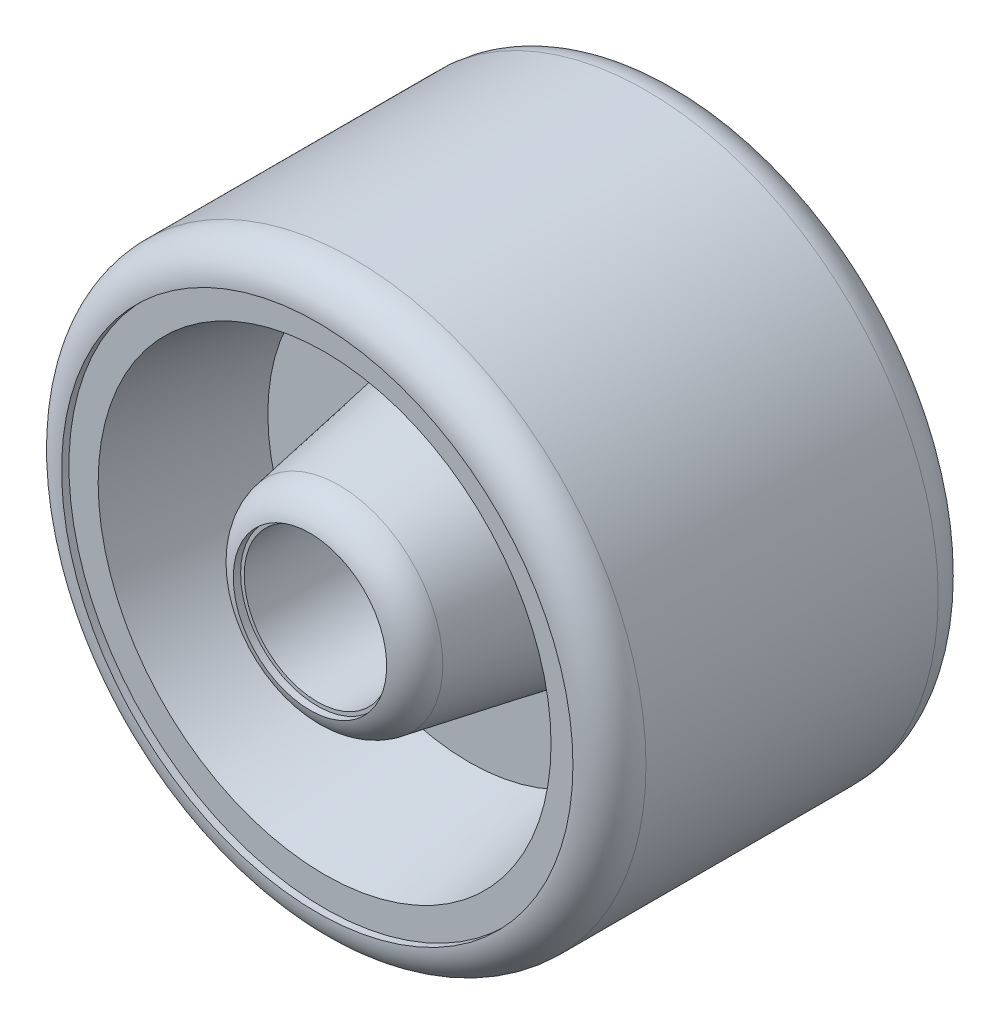
ISO-10303-21;
HEADER;
FILE_DESCRIPTION(('STEP AP214'),'2;1');
FILE_NAME('part.step','',(''),(''),'','','');
FILE_SCHEMA(('AUTOMOTIVE_DESIGN { 1 0 10303 214 1 1 1 1 }'));
ENDSEC;
DATA;
#1=APPLICATION_CONTEXT('core data for automotive mechanical design processes');
#2=APPLICATION_PROTOCOL_DEFINITION('international standard','automotive_design',2000,#1);
#3=PRODUCT_CONTEXT('',#1,'mechanical');
#4=PRODUCT('Part','Part','',(#3));
#5=PRODUCT_RELATED_PRODUCT_CATEGORY('part','',(#4));
#6=PRODUCT_DEFINITION_FORMATION('','',#4);
#7=PRODUCT_DEFINITION_CONTEXT('part definition',#1,'design');
#8=PRODUCT_DEFINITION('design','',#6,#7);
#9=PRODUCT_DEFINITION_SHAPE('','',#8);
#10=(LENGTH_UNIT() NAMED_UNIT(*) SI_UNIT(.MILLI.,.METRE.));
#11=(NAMED_UNIT(*) PLANE_ANGLE_UNIT() SI_UNIT($,.RADIAN.));
#12=(NAMED_UNIT(*) SI_UNIT($,.STERADIAN.) SOLID_ANGLE_UNIT());
#13=UNCERTAINTY_MEASURE_WITH_UNIT(LENGTH_MEASURE(1.E-05),#10,'distance_accuracy_value','');
#14=(GEOMETRIC_REPRESENTATION_CONTEXT(3) GLOBAL_UNCERTAINTY_ASSIGNED_CONTEXT((#13)) GLOBAL_UNIT_ASSIGNED_CONTEXT((#10,
#11,#12)) REPRESENTATION_CONTEXT('',''));
#15=CARTESIAN_POINT('',(0.,0.,0.));
#16=DIRECTION('',(0.,0.,1.));
#17=DIRECTION('',(1.,0.,0.));
#18=AXIS2_PLACEMENT_3D('',#15,#16,#17);
#19=CARTESIAN_POINT('',(0.,0.,-5.2));
#20=DIRECTION('',(0.,0.,1.));
#21=DIRECTION('',(1.,0.,0.));
#22=AXIS2_PLACEMENT_3D('',#19,#20,#21);
#23=CONICAL_SURFACE('',#22,2.7,0.17453292519943);
#24=CARTESIAN_POINT('',(0.,0.,-4.40398603033135));
#25=DIRECTION('',(0.,0.,1.));
#26=DIRECTION('',(1.,0.,0.));
#27=AXIS2_PLACEMENT_3D('',#24,#25,#26);
#28=CIRCLE('',#27,2.84035873987343);
#29=CARTESIAN_POINT('',(2.84035873987343,0.,-4.40398603033135));
#30=VERTEX_POINT('',#29);
#31=EDGE_CURVE('E11',#30,#30,#28,.T.);
#32=ORIENTED_EDGE('',*,*,#31,.T.);
#33=EDGE_LOOP('',(#32));
#34=FACE_BOUND('',#33,.T.);
#35=CARTESIAN_POINT('',(-0.408507555009763,0.,-4.55795216445944));
#36=DIRECTION('',(0.6357072528611,0.,0.77193023561705));
#37=DIRECTION('',(-0.77193023561705,0.,0.6357072528611));
#38=AXIS2_PLACEMENT_3D('',#35,#36,#37);
#39=ELLIPSE('',#38,3.64438420275442,2.78339254981343);
#40=CARTESIAN_POINT('',(-3.0873299939569,-0.85,-2.35186309709122));
#41=VERTEX_POINT('',#40);
#42=CARTESIAN_POINT('',(-3.0873299939569,0.85,-2.35186309709122));
#43=VERTEX_POINT('',#42);
#44=EDGE_CURVE('E55',#41,#43,#39,.F.);
#45=ORIENTED_EDGE('',*,*,#44,.T.);
#46=CARTESIAN_POINT('',(-2.6955284811266,0.85,-4.48331367974718));
#47=CARTESIAN_POINT('',(-2.76849470780288,0.85,-4.08863495322271));
#48=CARTESIAN_POINT('',(-2.84121082290954,0.85,-3.6939101053953));
#49=CARTESIAN_POINT('',(-2.98623000568182,0.85,-2.90438467063099));
#50=CARTESIAN_POINT('',(-3.05853307349392,0.85,-2.509584083721));
#51=CARTESIAN_POINT('',(-3.27495337155501,0.85,-1.32509400854848));
#52=CARTESIAN_POINT('',(-3.41858187322156,0.85,-0.535315247189798));
#53=CARTESIAN_POINT('',(-3.61183976031534,0.85,0.530791513182152));
#54=CARTESIAN_POINT('',(-3.66186159002427,0.85,0.807048459745819));
#55=CARTESIAN_POINT('',(-3.71183747467513,0.85,1.08331367974719));
#56=B_SPLINE_CURVE_WITH_KNOTS('',3,(#46,#47,#48,#49,#50,#51,#52,#53,#54,#55),.UNSPECIFIED.,.F.,
.F.,(4,2,2,2,4),(0.,1.20410036856632,2.4082003100859,4.81639726867198,5.65864466793987),.UNSPECIFIED.);
#57=CARTESIAN_POINT('',(-3.36121169921079,0.85,-0.849999999999999));
#58=VERTEX_POINT('',#57);
#59=EDGE_CURVE('E87',#43,#58,#56,.T.);
#60=ORIENTED_EDGE('',*,*,#59,.T.);
#61=CARTESIAN_POINT('',(0.,0.,-0.849999999999999));
#62=DIRECTION('',(0.,0.,-1.));
#63=DIRECTION('',(-1.,0.,0.));
#64=AXIS2_PLACEMENT_3D('',#61,#62,#63);
#65=CIRCLE('',#64,3.46702236608181);
#66=CARTESIAN_POINT('',(-3.36121169921079,-0.85,-0.849999999999999));
#67=VERTEX_POINT('',#66);
#68=EDGE_CURVE('E189',#58,#67,#65,.T.);
#69=ORIENTED_EDGE('',*,*,#68,.T.);
#70=CARTESIAN_POINT('',(-2.6955284811266,-0.85,-4.48331367974718));
#71=CARTESIAN_POINT('',(-2.76849470780288,-0.85,-4.08863495322271));
#72=CARTESIAN_POINT('',(-2.84121082290953,-0.85,-3.6939101053953));
#73=CARTESIAN_POINT('',(-2.98623000568182,-0.85,-2.90438467063099));
#74=CARTESIAN_POINT('',(-3.05853307349392,-0.85,-2.50958408372101));
#75=CARTESIAN_POINT('',(-3.27495337155501,-0.85,-1.32509400854848));
#76=CARTESIAN_POINT('',(-3.41858187322156,-0.85,-0.535315247189802));
#77=CARTESIAN_POINT('',(-3.61183976031534,-0.85,0.530791513182149));
#78=CARTESIAN_POINT('',(-3.66186159002427,-0.85,0.807048459745817));
#79=CARTESIAN_POINT('',(-3.71183747467513,-0.85,1.08331367974719));
#80=B_SPLINE_CURVE_WITH_KNOTS('',3,(#70,#71,#72,#73,#74,#75,#76,#77,#78,#79),.UNSPECIFIED.,.F.,
.F.,(4,2,2,2,4),(0.,1.20410036856632,2.4082003100859,4.81639726867198,5.65864466793988),.UNSPECIFIED.);
#81=EDGE_CURVE('E60',#41,#67,#80,.T.);
#82=ORIENTED_EDGE('',*,*,#81,.F.);
#83=EDGE_LOOP('',(#45,#60,#69,#82));
#84=FACE_BOUND('',#83,.T.);
#85=ADVANCED_FACE('F40',(#34,#84),#23,.T.);
#86=CARTESIAN_POINT('',(-3.46702236608181,0.,-0.849999999999999));
#87=DIRECTION('',(0.,0.,-1.));
#88=DIRECTION('',(-1.,0.,0.));
#89=AXIS2_PLACEMENT_3D('',#86,#87,#88);
#90=PLANE('',#89);
#91=CARTESIAN_POINT('',(0.,0.,-0.85));
#92=DIRECTION('',(0.,0.,-1.));
#93=DIRECTION('',(-1.,0.,0.));
#94=AXIS2_PLACEMENT_3D('',#91,#92,#93);
#95=CIRCLE('',#94,5.50350842620158);
#96=CARTESIAN_POINT('',(-5.50350842620158,0.,-0.849999999999999));
#97=VERTEX_POINT('',#96);
#98=EDGE_CURVE('E187',#97,#97,#95,.T.);
#99=ORIENTED_EDGE('',*,*,#98,.T.);
#100=EDGE_LOOP('',(#99));
#101=FACE_BOUND('',#100,.T.);
#102=ORIENTED_EDGE('',*,*,#68,.F.);
#103=DIRECTION('',(1.,0.,0.));
#104=VECTOR('',#103,1.);
#105=CARTESIAN_POINT('',(-2.54673518328194,0.85,-0.85));
#106=LINE('',#105,#104);
#107=CARTESIAN_POINT('',(-4.54673518328194,0.85,-0.849999999999999));
#108=VERTEX_POINT('',#107);
#109=EDGE_CURVE('E102',#108,#58,#106,.T.);
#110=ORIENTED_EDGE('',*,*,#109,.F.);
#111=DIRECTION('',(0.,-1.,0.));
#112=VECTOR('',#111,1.);
#113=CARTESIAN_POINT('',(-4.54673518328194,0.85,-0.850000000000001));
#114=LINE('',#113,#112);
#115=CARTESIAN_POINT('',(-4.54673518328194,-0.85,-0.850000000000001));
#116=VERTEX_POINT('',#115);
#117=EDGE_CURVE('E99',#108,#116,#114,.T.);
#118=ORIENTED_EDGE('',*,*,#117,.T.);
#119=DIRECTION('',(1.,0.,0.));
#120=VECTOR('',#119,1.);
#121=CARTESIAN_POINT('',(-2.54673518328194,-0.85,-0.85));
#122=LINE('',#121,#120);
#123=EDGE_CURVE('E89',#116,#67,#122,.T.);
#124=ORIENTED_EDGE('',*,*,#123,.T.);
#125=EDGE_LOOP('',(#102,#110,#118,#124));
#126=FACE_BOUND('',#125,.T.);
#127=ADVANCED_FACE('F171',(#101,#126),#90,.T.);
#128=CARTESIAN_POINT('',(0.,0.,5.));
#129=DIRECTION('',(0.,0.,-1.));
#130=DIRECTION('',(-1.,0.,0.));
#131=AXIS2_PLACEMENT_3D('',#128,#129,#130);
#132=CYLINDRICAL_SURFACE('',#131,7.);
#133=CARTESIAN_POINT('',(0.,0.,-4.8));
#134=DIRECTION('',(0.,0.,-1.));
#135=DIRECTION('',(-1.,0.,0.));
#136=AXIS2_PLACEMENT_3D('',#133,#134,#135);
#137=CIRCLE('',#136,7.);
#138=CARTESIAN_POINT('',(-7.,0.,-4.8));
#139=VERTEX_POINT('',#138);
#140=EDGE_CURVE('E217',#139,#139,#137,.T.);
#141=ORIENTED_EDGE('',*,*,#140,.F.);
#142=EDGE_LOOP('',(#141));
#143=FACE_BOUND('',#142,.T.);
#144=CARTESIAN_POINT('',(0.,0.,-5.));
#145=DIRECTION('',(0.,0.,1.));
#146=DIRECTION('',(1.,0.,0.));
#147=AXIS2_PLACEMENT_3D('',#144,#145,#146);
#148=CIRCLE('',#147,7.);
#149=CARTESIAN_POINT('',(7.,0.,-5.));
#150=VERTEX_POINT('',#149);
#151=EDGE_CURVE('E202',#150,#150,#148,.T.);
#152=ORIENTED_EDGE('',*,*,#151,.F.);
#153=EDGE_LOOP('',(#152));
#154=FACE_BOUND('',#153,.T.);
#155=ADVANCED_FACE('F173',(#143,#154),#132,.F.);
#156=CARTESIAN_POINT('',(0.,0.,5.));
#157=DIRECTION('',(0.,0.,-1.));
#158=DIRECTION('',(-1.,0.,0.));
#159=AXIS2_PLACEMENT_3D('',#156,#157,#158);
#160=CYLINDRICAL_SURFACE('',#159,8.);
#161=CARTESIAN_POINT('',(0.,0.,-4.));
#162=DIRECTION('',(0.,0.,1.));
#163=DIRECTION('',(1.,0.,0.));
#164=AXIS2_PLACEMENT_3D('',#161,#162,#163);
#165=CIRCLE('',#164,8.);
#166=CARTESIAN_POINT('',(8.,0.,-4.));
#167=VERTEX_POINT('',#166);
#168=EDGE_CURVE('E211',#167,#167,#165,.T.);
#169=ORIENTED_EDGE('',*,*,#168,.T.);
#170=EDGE_LOOP('',(#169));
#171=FACE_BOUND('',#170,.T.);
#172=CARTESIAN_POINT('',(0.,0.,4.));
#173=DIRECTION('',(0.,0.,1.));
#174=DIRECTION('',(1.,0.,0.));
#175=AXIS2_PLACEMENT_3D('',#172,#173,#174);
#176=CIRCLE('',#175,8.);
#177=CARTESIAN_POINT('',(8.,0.,4.));
#178=VERTEX_POINT('',#177);
#179=EDGE_CURVE('E206',#178,#178,#176,.F.);
#180=ORIENTED_EDGE('',*,*,#179,.T.);
#181=EDGE_LOOP('',(#180));
#182=FACE_BOUND('',#181,.T.);
#183=ADVANCED_FACE('F179',(#171,#182),#160,.T.);
#184=CARTESIAN_POINT('',(0.,0.,4.8));
#185=DIRECTION('',(0.,0.,1.));
#186=DIRECTION('',(1.,0.,0.));
#187=AXIS2_PLACEMENT_3D('',#184,#185,#186);
#188=CIRCLE('',#187,7.);
#189=CARTESIAN_POINT('',(7.,0.,4.8));
#190=VERTEX_POINT('',#189);
#191=EDGE_CURVE('E214',#190,#190,#188,.T.);
#192=ORIENTED_EDGE('',*,*,#191,.F.);
#193=EDGE_LOOP('',(#192));
#194=FACE_BOUND('',#193,.T.);
#195=CARTESIAN_POINT('',(0.,0.,5.));
#196=DIRECTION('',(0.,0.,1.));
#197=DIRECTION('',(1.,0.,0.));
#198=AXIS2_PLACEMENT_3D('',#195,#196,#197);
#199=CIRCLE('',#198,7.);
#200=CARTESIAN_POINT('',(7.,0.,5.));
#201=VERTEX_POINT('',#200);
#202=EDGE_CURVE('E203',#201,#201,#199,.T.);
#203=ORIENTED_EDGE('',*,*,#202,.T.);
#204=EDGE_LOOP('',(#203));
#205=FACE_BOUND('',#204,.T.);
#206=ADVANCED_FACE('F182',(#194,#205),#132,.F.);
#207=CARTESIAN_POINT('',(0.,0.,-4.));
#208=DIRECTION('',(0.,0.,1.));
#209=DIRECTION('',(1.,0.,0.));
#210=AXIS2_PLACEMENT_3D('',#207,#208,#209);
#211=TOROIDAL_SURFACE('',#210,7.,1.);
#212=ORIENTED_EDGE('',*,*,#151,.T.);
#213=EDGE_LOOP('',(#212));
#214=FACE_BOUND('',#213,.T.);
#215=ORIENTED_EDGE('',*,*,#168,.F.);
#216=EDGE_LOOP('',(#215));
#217=FACE_BOUND('',#216,.T.);
#218=ADVANCED_FACE('F241',(#214,#217),#211,.T.);
#219=CARTESIAN_POINT('',(0.,0.,4.));
#220=DIRECTION('',(0.,0.,1.));
#221=DIRECTION('',(1.,0.,0.));
#222=AXIS2_PLACEMENT_3D('',#219,#220,#221);
#223=TOROIDAL_SURFACE('',#222,7.,1.);
#224=ORIENTED_EDGE('',*,*,#179,.F.);
#225=EDGE_LOOP('',(#224));
#226=FACE_BOUND('',#225,.T.);
#227=ORIENTED_EDGE('',*,*,#202,.F.);
#228=EDGE_LOOP('',(#227));
#229=FACE_BOUND('',#228,.T.);
#230=ADVANCED_FACE('F238',(#226,#229),#223,.T.);
#231=CARTESIAN_POINT('',(0.,0.,5.));
#232=DIRECTION('',(0.,0.,1.));
#233=DIRECTION('',(1.,0.,0.));
#234=AXIS2_PLACEMENT_3D('',#231,#232,#233);
#235=PLANE('',#234);
#236=CARTESIAN_POINT('',(0.,0.,5.));
#237=DIRECTION('',(0.,0.,1.));
#238=DIRECTION('',(1.,0.,0.));
#239=AXIS2_PLACEMENT_3D('',#236,#237,#238);
#240=CIRCLE('',#239,2.);
#241=CARTESIAN_POINT('',(2.,0.,5.));
#242=VERTEX_POINT('',#241);
#243=EDGE_CURVE('E109',#242,#242,#240,.T.);
#244=ORIENTED_EDGE('',*,*,#243,.F.);
#245=EDGE_LOOP('',(#244));
#246=FACE_BOUND('',#245,.T.);
#247=CARTESIAN_POINT('',(0.,0.,5.));
#248=DIRECTION('',(0.,0.,-1.));
#249=DIRECTION('',(-1.,0.,0.));
#250=AXIS2_PLACEMENT_3D('',#247,#248,#249);
#251=CIRCLE('',#250,2.1);
#252=CARTESIAN_POINT('',(-2.1,0.,5.));
#253=VERTEX_POINT('',#252);
#254=EDGE_CURVE('E459',#253,#253,#251,.T.);
#255=ORIENTED_EDGE('',*,*,#254,.F.);
#256=EDGE_LOOP('',(#255));
#257=FACE_BOUND('',#256,.T.);
#258=ADVANCED_FACE('F146',(#246,#257),#235,.T.);
#259=CARTESIAN_POINT('',(0.,0.,-5.));
#260=DIRECTION('',(0.,0.,-1.));
#261=DIRECTION('',(-1.,0.,0.));
#262=AXIS2_PLACEMENT_3D('',#259,#260,#261);
#263=CYLINDRICAL_SURFACE('',#262,2.1);
#264=ORIENTED_EDGE('',*,*,#254,.T.);
#265=EDGE_LOOP('',(#264));
#266=FACE_BOUND('',#265,.T.);
#267=CARTESIAN_POINT('',(0.,0.,5.2));
#268=DIRECTION('',(0.,0.,-1.));
#269=DIRECTION('',(-1.,0.,0.));
#270=AXIS2_PLACEMENT_3D('',#267,#268,#269);
#271=CIRCLE('',#270,2.1);
#272=CARTESIAN_POINT('',(-2.1,0.,5.2));
#273=VERTEX_POINT('',#272);
#274=EDGE_CURVE('E460',#273,#273,#271,.T.);
#275=ORIENTED_EDGE('',*,*,#274,.F.);
#276=EDGE_LOOP('',(#275));
#277=FACE_BOUND('',#276,.T.);
#278=ADVANCED_FACE('F142',(#266,#277),#263,.F.);
#279=CARTESIAN_POINT('',(0.,0.,0.85));
#280=DIRECTION('',(0.,0.,-1.));
#281=DIRECTION('',(-1.,0.,0.));
#282=AXIS2_PLACEMENT_3D('',#279,#280,#281);
#283=CONICAL_SURFACE('',#282,3.46702236608181,0.17453292519943);
#284=CARTESIAN_POINT('',(0.,0.,4.40398603033133));
#285=DIRECTION('',(0.,0.,-1.));
#286=DIRECTION('',(-1.,0.,0.));
#287=AXIS2_PLACEMENT_3D('',#284,#285,#286);
#288=CIRCLE('',#287,2.84035873987343);
#289=CARTESIAN_POINT('',(-2.84035873987343,0.,4.40398603033133));
#290=VERTEX_POINT('',#289);
#291=EDGE_CURVE('E48',#290,#290,#288,.T.);
#292=ORIENTED_EDGE('',*,*,#291,.T.);
#293=EDGE_LOOP('',(#292));
#294=FACE_BOUND('',#293,.T.);
#295=CARTESIAN_POINT('',(0.,0.,0.85));
#296=DIRECTION('',(0.,0.,-1.));
#297=DIRECTION('',(-1.,0.,0.));
#298=AXIS2_PLACEMENT_3D('',#295,#296,#297);
#299=CIRCLE('',#298,3.46702236608181);
#300=CARTESIAN_POINT('',(-3.46702236608181,0.,0.850000000000001));
#301=VERTEX_POINT('',#300);
#302=EDGE_CURVE('E461',#301,#301,#299,.T.);
#303=ORIENTED_EDGE('',*,*,#302,.F.);
#304=EDGE_LOOP('',(#303));
#305=FACE_BOUND('',#304,.T.);
#306=ADVANCED_FACE('F145',(#294,#305),#283,.T.);
#307=CARTESIAN_POINT('',(-3.46702236608181,0.,0.85));
#308=DIRECTION('',(0.,0.,1.));
#309=DIRECTION('',(1.,0.,0.));
#310=AXIS2_PLACEMENT_3D('',#307,#308,#309);
#311=PLANE('',#310);
#312=ORIENTED_EDGE('',*,*,#302,.T.);
#313=EDGE_LOOP('',(#312));
#314=FACE_BOUND('',#313,.T.);
#315=CARTESIAN_POINT('',(0.,0.,0.85));
#316=DIRECTION('',(0.,0.,-1.));
#317=DIRECTION('',(-1.,0.,0.));
#318=AXIS2_PLACEMENT_3D('',#315,#316,#317);
#319=CIRCLE('',#318,5.50350842620158);
#320=CARTESIAN_POINT('',(-5.50350842620158,0.,0.850000000000001));
#321=VERTEX_POINT('',#320);
#322=EDGE_CURVE('E466',#321,#321,#319,.T.);
#323=ORIENTED_EDGE('',*,*,#322,.F.);
#324=EDGE_LOOP('',(#323));
#325=FACE_BOUND('',#324,.T.);
#326=ADVANCED_FACE('F150',(#314,#325),#311,.T.);
#327=CARTESIAN_POINT('',(0.,0.,4.8));
#328=DIRECTION('',(0.,0.,1.));
#329=DIRECTION('',(1.,0.,0.));
#330=AXIS2_PLACEMENT_3D('',#327,#328,#329);
#331=CONICAL_SURFACE('',#330,6.2,0.174532925199429);
#332=ORIENTED_EDGE('',*,*,#322,.T.);
#333=EDGE_LOOP('',(#332));
#334=FACE_BOUND('',#333,.T.);
#335=CARTESIAN_POINT('',(0.,0.,4.8));
#336=DIRECTION('',(0.,0.,-1.));
#337=DIRECTION('',(-1.,0.,0.));
#338=AXIS2_PLACEMENT_3D('',#335,#336,#337);
#339=CIRCLE('',#338,6.2);
#340=CARTESIAN_POINT('',(-6.2,0.,4.8));
#341=VERTEX_POINT('',#340);
#342=EDGE_CURVE('E469',#341,#341,#339,.T.);
#343=ORIENTED_EDGE('',*,*,#342,.F.);
#344=EDGE_LOOP('',(#343));
#345=FACE_BOUND('',#344,.T.);
#346=ADVANCED_FACE('F154',(#334,#345),#331,.F.);
#347=CARTESIAN_POINT('',(-6.2,0.,4.8));
#348=DIRECTION('',(0.,0.,1.));
#349=DIRECTION('',(1.,0.,0.));
#350=AXIS2_PLACEMENT_3D('',#347,#348,#349);
#351=PLANE('',#350);
#352=ORIENTED_EDGE('',*,*,#342,.T.);
#353=EDGE_LOOP('',(#352));
#354=FACE_BOUND('',#353,.T.);
#355=ORIENTED_EDGE('',*,*,#191,.T.);
#356=EDGE_LOOP('',(#355));
#357=FACE_BOUND('',#356,.T.);
#358=ADVANCED_FACE('F158',(#354,#357),#351,.T.);
#359=CARTESIAN_POINT('',(0.,0.,-5.));
#360=DIRECTION('',(0.,0.,-1.));
#361=DIRECTION('',(-1.,0.,0.));
#362=AXIS2_PLACEMENT_3D('',#359,#360,#361);
#363=PLANE('',#362);
#364=CARTESIAN_POINT('',(0.,0.,-5.));
#365=DIRECTION('',(0.,0.,-1.));
#366=DIRECTION('',(-1.,0.,0.));
#367=AXIS2_PLACEMENT_3D('',#364,#365,#366);
#368=CIRCLE('',#367,2.);
#369=CARTESIAN_POINT('',(-2.,0.,-5.));
#370=VERTEX_POINT('',#369);
#371=EDGE_CURVE('E222',#370,#370,#368,.T.);
#372=ORIENTED_EDGE('',*,*,#371,.F.);
#373=EDGE_LOOP('',(#372));
#374=FACE_BOUND('',#373,.T.);
#375=CARTESIAN_POINT('',(0.,0.,-5.));
#376=DIRECTION('',(0.,0.,-1.));
#377=DIRECTION('',(-1.,0.,0.));
#378=AXIS2_PLACEMENT_3D('',#375,#376,#377);
#379=CIRCLE('',#378,2.1);
#380=CARTESIAN_POINT('',(-2.1,0.,-5.));
#381=VERTEX_POINT('',#380);
#382=EDGE_CURVE('E194',#381,#381,#379,.T.);
#383=ORIENTED_EDGE('',*,*,#382,.T.);
#384=EDGE_LOOP('',(#383));
#385=FACE_BOUND('',#384,.T.);
#386=ADVANCED_FACE('F162',(#374,#385),#363,.T.);
#387=CARTESIAN_POINT('',(0.,0.,-5.));
#388=DIRECTION('',(0.,0.,-1.));
#389=DIRECTION('',(-1.,0.,0.));
#390=AXIS2_PLACEMENT_3D('',#387,#388,#389);
#391=CYLINDRICAL_SURFACE('',#390,2.1);
#392=CARTESIAN_POINT('',(0.,0.,-5.2));
#393=DIRECTION('',(0.,0.,-1.));
#394=DIRECTION('',(-1.,0.,0.));
#395=AXIS2_PLACEMENT_3D('',#392,#393,#394);
#396=CIRCLE('',#395,2.1);
#397=CARTESIAN_POINT('',(-2.1,0.,-5.2));
#398=VERTEX_POINT('',#397);
#399=EDGE_CURVE('E191',#398,#398,#396,.T.);
#400=ORIENTED_EDGE('',*,*,#399,.T.);
#401=EDGE_LOOP('',(#400));
#402=FACE_BOUND('',#401,.T.);
#403=ORIENTED_EDGE('',*,*,#382,.F.);
#404=EDGE_LOOP('',(#403));
#405=FACE_BOUND('',#404,.T.);
#406=ADVANCED_FACE('F169',(#402,#405),#391,.F.);
#407=CARTESIAN_POINT('',(0.,0.,-0.85));
#408=DIRECTION('',(0.,0.,-1.));
#409=DIRECTION('',(-1.,0.,0.));
#410=AXIS2_PLACEMENT_3D('',#407,#408,#409);
#411=CONICAL_SURFACE('',#410,5.50350842620158,0.174532925199429);
#412=CARTESIAN_POINT('',(0.,0.,-4.8));
#413=DIRECTION('',(0.,0.,-1.));
#414=DIRECTION('',(-1.,0.,0.));
#415=AXIS2_PLACEMENT_3D('',#412,#413,#414);
#416=CIRCLE('',#415,6.2);
#417=CARTESIAN_POINT('',(-6.2,0.,-4.8));
#418=VERTEX_POINT('',#417);
#419=EDGE_CURVE('E196',#418,#418,#416,.T.);
#420=ORIENTED_EDGE('',*,*,#419,.T.);
#421=EDGE_LOOP('',(#420));
#422=FACE_BOUND('',#421,.T.);
#423=ORIENTED_EDGE('',*,*,#98,.F.);
#424=EDGE_LOOP('',(#423));
#425=FACE_BOUND('',#424,.T.);
#426=ADVANCED_FACE('F166',(#422,#425),#411,.F.);
#427=CARTESIAN_POINT('',(-6.2,0.,-4.8));
#428=DIRECTION('',(0.,0.,-1.));
#429=DIRECTION('',(-1.,0.,0.));
#430=AXIS2_PLACEMENT_3D('',#427,#428,#429);
#431=PLANE('',#430);
#432=ORIENTED_EDGE('',*,*,#140,.T.);
#433=EDGE_LOOP('',(#432));
#434=FACE_BOUND('',#433,.T.);
#435=ORIENTED_EDGE('',*,*,#419,.F.);
#436=EDGE_LOOP('',(#435));
#437=FACE_BOUND('',#436,.T.);
#438=ADVANCED_FACE('F141',(#434,#437),#431,.T.);
#439=CARTESIAN_POINT('',(-4.54673518328194,0.85,-1.15));
#440=DIRECTION('',(0.6357072528611,0.,0.77193023561705));
#441=DIRECTION('',(0.77193023561705,0.,-0.6357072528611));
#442=AXIS2_PLACEMENT_3D('',#439,#440,#441);
#443=PLANE('',#442);
#444=ORIENTED_EDGE('',*,*,#44,.F.);
#445=DIRECTION('',(-0.77193023561705,0.,0.6357072528611));
#446=VECTOR('',#445,1.);
#447=CARTESIAN_POINT('',(-4.54673518328194,-0.85,-1.15));
#448=LINE('',#447,#446);
#449=CARTESIAN_POINT('',(-4.54673518328194,-0.85,-1.15));
#450=VERTEX_POINT('',#449);
#451=EDGE_CURVE('E95',#41,#450,#448,.T.);
#452=ORIENTED_EDGE('',*,*,#451,.T.);
#453=DIRECTION('',(0.,-1.,0.));
#454=VECTOR('',#453,1.);
#455=CARTESIAN_POINT('',(-4.54673518328194,0.85,-1.15));
#456=LINE('',#455,#454);
#457=CARTESIAN_POINT('',(-4.54673518328194,0.85,-1.15));
#458=VERTEX_POINT('',#457);
#459=EDGE_CURVE('E92',#458,#450,#456,.T.);
#460=ORIENTED_EDGE('',*,*,#459,.F.);
#461=DIRECTION('',(-0.77193023561705,0.,0.6357072528611));
#462=VECTOR('',#461,1.);
#463=CARTESIAN_POINT('',(-4.54673518328194,0.85,-1.15));
#464=LINE('',#463,#462);
#465=EDGE_CURVE('E80',#43,#458,#464,.T.);
#466=ORIENTED_EDGE('',*,*,#465,.F.);
#467=EDGE_LOOP('',(#444,#452,#460,#466));
#468=FACE_BOUND('',#467,.T.);
#469=ADVANCED_FACE('F93',(#468),#443,.F.);
#470=CARTESIAN_POINT('',(-4.54673518328194,0.85,-0.850000000000001));
#471=DIRECTION('',(1.,0.,0.));
#472=DIRECTION('',(0.,0.,-1.));
#473=AXIS2_PLACEMENT_3D('',#470,#471,#472);
#474=PLANE('',#473);
#475=DIRECTION('',(0.,0.,1.));
#476=VECTOR('',#475,1.);
#477=CARTESIAN_POINT('',(-4.54673518328194,-0.85,-0.850000000000001));
#478=LINE('',#477,#476);
#479=EDGE_CURVE('E108',#450,#116,#478,.T.);
#480=ORIENTED_EDGE('',*,*,#479,.T.);
#481=ORIENTED_EDGE('',*,*,#117,.F.);
#482=DIRECTION('',(0.,0.,1.));
#483=VECTOR('',#482,1.);
#484=CARTESIAN_POINT('',(-4.54673518328194,0.85,-0.850000000000001));
#485=LINE('',#484,#483);
#486=EDGE_CURVE('E85',#458,#108,#485,.T.);
#487=ORIENTED_EDGE('',*,*,#486,.F.);
#488=ORIENTED_EDGE('',*,*,#459,.T.);
#489=EDGE_LOOP('',(#480,#481,#487,#488));
#490=FACE_BOUND('',#489,.T.);
#491=ADVANCED_FACE('F101',(#490),#474,.F.);
#492=CARTESIAN_POINT('',(0.,0.85,0.));
#493=DIRECTION('',(0.,-1.,0.));
#494=DIRECTION('',(0.,0.,-1.));
#495=AXIS2_PLACEMENT_3D('',#492,#493,#494);
#496=PLANE('',#495);
#497=ORIENTED_EDGE('',*,*,#59,.F.);
#498=ORIENTED_EDGE('',*,*,#465,.T.);
#499=ORIENTED_EDGE('',*,*,#486,.T.);
#500=ORIENTED_EDGE('',*,*,#109,.T.);
#501=EDGE_LOOP('',(#497,#498,#499,#500));
#502=FACE_BOUND('',#501,.T.);
#503=ADVANCED_FACE('F82',(#502),#496,.F.);
#504=CARTESIAN_POINT('',(0.,-0.85,0.));
#505=DIRECTION('',(0.,-1.,0.));
#506=DIRECTION('',(0.,0.,-1.));
#507=AXIS2_PLACEMENT_3D('',#504,#505,#506);
#508=PLANE('',#507);
#509=ORIENTED_EDGE('',*,*,#451,.F.);
#510=ORIENTED_EDGE('',*,*,#81,.T.);
#511=ORIENTED_EDGE('',*,*,#123,.F.);
#512=ORIENTED_EDGE('',*,*,#479,.F.);
#513=EDGE_LOOP('',(#509,#510,#511,#512));
#514=FACE_BOUND('',#513,.T.);
#515=ADVANCED_FACE('F129',(#514),#508,.T.);
#516=CARTESIAN_POINT('',(0.,0.,5.2));
#517=DIRECTION('',(0.,0.,-1.));
#518=DIRECTION('',(-1.,0.,0.));
#519=AXIS2_PLACEMENT_3D('',#516,#517,#518);
#520=CYLINDRICAL_SURFACE('',#519,2.);
#521=ORIENTED_EDGE('',*,*,#243,.T.);
#522=EDGE_LOOP('',(#521));
#523=FACE_BOUND('',#522,.T.);
#524=ORIENTED_EDGE('',*,*,#371,.T.);
#525=EDGE_LOOP('',(#524));
#526=FACE_BOUND('',#525,.T.);
#527=ADVANCED_FACE('F133',(#523,#526),#520,.F.);
#528=CARTESIAN_POINT('',(0.,0.,4.23033785266441));
#529=DIRECTION('',(0.,0.,1.));
#530=DIRECTION('',(1.,0.,0.));
#531=AXIS2_PLACEMENT_3D('',#528,#529,#530);
#532=TOROIDAL_SURFACE('',#531,1.85555098686122,1.);
#533=ORIENTED_EDGE('',*,*,#274,.T.);
#534=EDGE_LOOP('',(#533));
#535=FACE_BOUND('',#534,.T.);
#536=ORIENTED_EDGE('',*,*,#291,.F.);
#537=EDGE_LOOP('',(#536));
#538=FACE_BOUND('',#537,.T.);
#539=ADVANCED_FACE('F227',(#535,#538),#532,.T.);
#540=CARTESIAN_POINT('',(0.,0.,-4.23033785266442));
#541=DIRECTION('',(0.,0.,-1.));
#542=DIRECTION('',(-1.,0.,0.));
#543=AXIS2_PLACEMENT_3D('',#540,#541,#542);
#544=TOROIDAL_SURFACE('',#543,1.85555098686122,1.);
#545=ORIENTED_EDGE('',*,*,#31,.F.);
#546=EDGE_LOOP('',(#545));
#547=FACE_BOUND('',#546,.T.);
#548=ORIENTED_EDGE('',*,*,#399,.F.);
#549=EDGE_LOOP('',(#548));
#550=FACE_BOUND('',#549,.T.);
#551=ADVANCED_FACE('F42',(#547,#550),#544,.T.);
#552=CLOSED_SHELL('',(#85,#127,#155,#183,#206,#218,#230,#258,#278,#306,#326,#346,#358,#386,#406,
#426,#438,#469,#491,#503,#515,#527,#539,#551));
#553=MANIFOLD_SOLID_BREP('B2',#552);
#554=ADVANCED_BREP_SHAPE_REPRESENTATION('',(#18,#553),#14);
#555=SHAPE_DEFINITION_REPRESENTATION(#9,#554);
ENDSEC;
END-ISO-10303-21;
